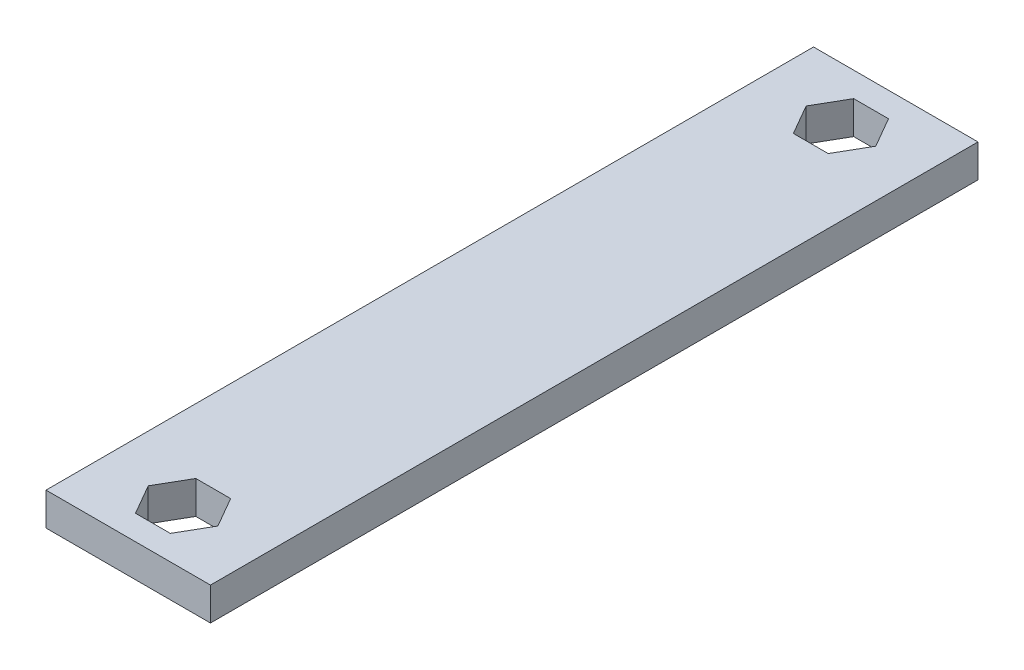
ISO-10303-21;
HEADER;
FILE_DESCRIPTION(('STEP AP214'),'2;1');
FILE_NAME('part.step','',(''),(''),'','','');
FILE_SCHEMA(('AUTOMOTIVE_DESIGN { 1 0 10303 214 1 1 1 1 }'));
ENDSEC;
DATA;
#1=APPLICATION_CONTEXT('core data for automotive mechanical design processes');
#2=APPLICATION_PROTOCOL_DEFINITION('international standard','automotive_design',2000,#1);
#3=PRODUCT_CONTEXT('',#1,'mechanical');
#4=PRODUCT('Part','Part','',(#3));
#5=PRODUCT_RELATED_PRODUCT_CATEGORY('part','',(#4));
#6=PRODUCT_DEFINITION_FORMATION('','',#4);
#7=PRODUCT_DEFINITION_CONTEXT('part definition',#1,'design');
#8=PRODUCT_DEFINITION('design','',#6,#7);
#9=PRODUCT_DEFINITION_SHAPE('','',#8);
#10=(LENGTH_UNIT() NAMED_UNIT(*) SI_UNIT(.MILLI.,.METRE.));
#11=(NAMED_UNIT(*) PLANE_ANGLE_UNIT() SI_UNIT($,.RADIAN.));
#12=(NAMED_UNIT(*) SI_UNIT($,.STERADIAN.) SOLID_ANGLE_UNIT());
#13=UNCERTAINTY_MEASURE_WITH_UNIT(LENGTH_MEASURE(1.E-05),#10,'distance_accuracy_value','');
#14=(GEOMETRIC_REPRESENTATION_CONTEXT(3) GLOBAL_UNCERTAINTY_ASSIGNED_CONTEXT((#13)) GLOBAL_UNIT_ASSIGNED_CONTEXT((#10,
#11,#12)) REPRESENTATION_CONTEXT('',''));
#15=CARTESIAN_POINT('',(0.,0.,0.));
#16=DIRECTION('',(0.,0.,1.));
#17=DIRECTION('',(1.,0.,0.));
#18=AXIS2_PLACEMENT_3D('',#15,#16,#17);
#19=CARTESIAN_POINT('',(0.,3.,-62.25));
#20=DIRECTION('',(0.,0.,1.));
#21=DIRECTION('',(1.,0.,0.));
#22=AXIS2_PLACEMENT_3D('',#19,#20,#21);
#23=PLANE('',#22);
#24=DIRECTION('',(-1.,0.,0.));
#25=VECTOR('',#24,1.);
#26=CARTESIAN_POINT('',(0.,0.,-62.25));
#27=LINE('',#26,#25);
#28=CARTESIAN_POINT('',(9.08771324027147,0.,-62.25));
#29=VERTEX_POINT('',#28);
#30=CARTESIAN_POINT('',(5.91228675972853,0.,-62.25));
#31=VERTEX_POINT('',#30);
#32=EDGE_CURVE('E234',#29,#31,#27,.T.);
#33=ORIENTED_EDGE('',*,*,#32,.T.);
#34=DIRECTION('',(0.,-1.,0.));
#35=VECTOR('',#34,1.);
#36=CARTESIAN_POINT('',(5.91228675972853,3.,-62.25));
#37=LINE('',#36,#35);
#38=CARTESIAN_POINT('',(5.91228675972853,3.,-62.25));
#39=VERTEX_POINT('',#38);
#40=EDGE_CURVE('E11',#39,#31,#37,.T.);
#41=ORIENTED_EDGE('',*,*,#40,.F.);
#42=DIRECTION('',(-1.,0.,0.));
#43=VECTOR('',#42,1.);
#44=CARTESIAN_POINT('',(0.,3.,-62.25));
#45=LINE('',#44,#43);
#46=CARTESIAN_POINT('',(9.08771324027147,3.,-62.25));
#47=VERTEX_POINT('',#46);
#48=EDGE_CURVE('E341',#47,#39,#45,.T.);
#49=ORIENTED_EDGE('',*,*,#48,.F.);
#50=DIRECTION('',(0.,-1.,0.));
#51=VECTOR('',#50,1.);
#52=CARTESIAN_POINT('',(9.08771324027147,3.,-62.25));
#53=LINE('',#52,#51);
#54=EDGE_CURVE('E251',#47,#29,#53,.T.);
#55=ORIENTED_EDGE('',*,*,#54,.T.);
#56=EDGE_LOOP('',(#33,#41,#49,#55));
#57=FACE_BOUND('',#56,.T.);
#58=ADVANCED_FACE('F41',(#57),#23,.F.);
#59=CARTESIAN_POINT('',(31.3892557625871,3.,-18.1225952641916));
#60=DIRECTION('',(-0.866025403784439,0.,0.5));
#61=DIRECTION('',(0.5,0.,0.866025403784439));
#62=AXIS2_PLACEMENT_3D('',#59,#60,#61);
#63=PLANE('',#62);
#64=DIRECTION('',(-0.5,0.,-0.866025403784439));
#65=VECTOR('',#64,1.);
#66=CARTESIAN_POINT('',(31.3892557625871,0.,-18.1225952641916));
#67=LINE('',#66,#65);
#68=CARTESIAN_POINT('',(4.32457351945706,0.,-65.));
#69=VERTEX_POINT('',#68);
#70=EDGE_CURVE('E238',#31,#69,#67,.T.);
#71=ORIENTED_EDGE('',*,*,#70,.T.);
#72=DIRECTION('',(0.,-1.,0.));
#73=VECTOR('',#72,1.);
#74=CARTESIAN_POINT('',(4.32457351945706,3.,-65.));
#75=LINE('',#74,#73);
#76=CARTESIAN_POINT('',(4.32457351945706,3.,-65.));
#77=VERTEX_POINT('',#76);
#78=EDGE_CURVE('E52',#77,#69,#75,.T.);
#79=ORIENTED_EDGE('',*,*,#78,.F.);
#80=DIRECTION('',(-0.5,0.,-0.866025403784439));
#81=VECTOR('',#80,1.);
#82=CARTESIAN_POINT('',(31.3892557625871,3.,-18.1225952641916));
#83=LINE('',#82,#81);
#84=EDGE_CURVE('E344',#39,#77,#83,.T.);
#85=ORIENTED_EDGE('',*,*,#84,.F.);
#86=ORIENTED_EDGE('',*,*,#40,.T.);
#87=EDGE_LOOP('',(#71,#79,#85,#86));
#88=FACE_BOUND('',#87,.T.);
#89=ADVANCED_FACE('F351',(#88),#63,.F.);
#90=CARTESIAN_POINT('',(-24.9023954834015,3.,-14.3774047358085));
#91=DIRECTION('',(-0.866025403784438,0.,-0.500000000000002));
#92=DIRECTION('',(-0.500000000000002,0.,0.866025403784438));
#93=AXIS2_PLACEMENT_3D('',#90,#91,#92);
#94=PLANE('',#93);
#95=DIRECTION('',(0.500000000000002,0.,-0.866025403784438));
#96=VECTOR('',#95,1.);
#97=CARTESIAN_POINT('',(-24.9023954834015,0.,-14.3774047358085));
#98=LINE('',#97,#96);
#99=CARTESIAN_POINT('',(5.91228675972853,0.,-67.75));
#100=VERTEX_POINT('',#99);
#101=EDGE_CURVE('E241',#69,#100,#98,.T.);
#102=ORIENTED_EDGE('',*,*,#101,.T.);
#103=DIRECTION('',(0.,-1.,0.));
#104=VECTOR('',#103,1.);
#105=CARTESIAN_POINT('',(5.91228675972853,3.,-67.75));
#106=LINE('',#105,#104);
#107=CARTESIAN_POINT('',(5.91228675972853,3.,-67.75));
#108=VERTEX_POINT('',#107);
#109=EDGE_CURVE('E183',#108,#100,#106,.T.);
#110=ORIENTED_EDGE('',*,*,#109,.F.);
#111=DIRECTION('',(0.500000000000002,0.,-0.866025403784438));
#112=VECTOR('',#111,1.);
#113=CARTESIAN_POINT('',(-24.9023954834015,3.,-14.3774047358085));
#114=LINE('',#113,#112);
#115=EDGE_CURVE('E172',#77,#108,#114,.T.);
#116=ORIENTED_EDGE('',*,*,#115,.F.);
#117=ORIENTED_EDGE('',*,*,#78,.T.);
#118=EDGE_LOOP('',(#102,#110,#116,#117));
#119=FACE_BOUND('',#118,.T.);
#120=ADVANCED_FACE('F354',(#119),#94,.F.);
#121=CARTESIAN_POINT('',(0.,3.,-67.75));
#122=DIRECTION('',(0.,0.,-1.));
#123=DIRECTION('',(-1.,0.,0.));
#124=AXIS2_PLACEMENT_3D('',#121,#122,#123);
#125=PLANE('',#124);
#126=DIRECTION('',(1.,0.,0.));
#127=VECTOR('',#126,1.);
#128=CARTESIAN_POINT('',(0.,0.,-67.75));
#129=LINE('',#128,#127);
#130=CARTESIAN_POINT('',(9.08771324027147,0.,-67.75));
#131=VERTEX_POINT('',#130);
#132=EDGE_CURVE('E181',#100,#131,#129,.T.);
#133=ORIENTED_EDGE('',*,*,#132,.T.);
#134=DIRECTION('',(0.,-1.,0.));
#135=VECTOR('',#134,1.);
#136=CARTESIAN_POINT('',(9.08771324027147,3.,-67.75));
#137=LINE('',#136,#135);
#138=CARTESIAN_POINT('',(9.08771324027147,3.,-67.75));
#139=VERTEX_POINT('',#138);
#140=EDGE_CURVE('E178',#139,#131,#137,.T.);
#141=ORIENTED_EDGE('',*,*,#140,.F.);
#142=DIRECTION('',(1.,0.,0.));
#143=VECTOR('',#142,1.);
#144=CARTESIAN_POINT('',(0.,3.,-67.75));
#145=LINE('',#144,#143);
#146=EDGE_CURVE('E166',#108,#139,#145,.T.);
#147=ORIENTED_EDGE('',*,*,#146,.F.);
#148=ORIENTED_EDGE('',*,*,#109,.T.);
#149=EDGE_LOOP('',(#133,#141,#147,#148));
#150=FACE_BOUND('',#149,.T.);
#151=ADVANCED_FACE('F179',(#150),#125,.F.);
#152=CARTESIAN_POINT('',(36.1523954834015,3.,-20.8725952641917));
#153=DIRECTION('',(0.866025403784438,0.,-0.500000000000001));
#154=DIRECTION('',(-0.500000000000001,0.,-0.866025403784438));
#155=AXIS2_PLACEMENT_3D('',#152,#153,#154);
#156=PLANE('',#155);
#157=DIRECTION('',(0.500000000000001,0.,0.866025403784438));
#158=VECTOR('',#157,1.);
#159=CARTESIAN_POINT('',(36.1523954834015,0.,-20.8725952641917));
#160=LINE('',#159,#158);
#161=CARTESIAN_POINT('',(10.6754264805429,0.,-65.));
#162=VERTEX_POINT('',#161);
#163=EDGE_CURVE('E114',#131,#162,#160,.T.);
#164=ORIENTED_EDGE('',*,*,#163,.T.);
#165=DIRECTION('',(0.,-1.,0.));
#166=VECTOR('',#165,1.);
#167=CARTESIAN_POINT('',(10.6754264805429,3.,-65.));
#168=LINE('',#167,#166);
#169=CARTESIAN_POINT('',(10.6754264805429,3.,-65.));
#170=VERTEX_POINT('',#169);
#171=EDGE_CURVE('E184',#170,#162,#168,.T.);
#172=ORIENTED_EDGE('',*,*,#171,.F.);
#173=DIRECTION('',(0.500000000000001,0.,0.866025403784438));
#174=VECTOR('',#173,1.);
#175=CARTESIAN_POINT('',(36.1523954834015,3.,-20.8725952641917));
#176=LINE('',#175,#174);
#177=EDGE_CURVE('E170',#139,#170,#176,.T.);
#178=ORIENTED_EDGE('',*,*,#177,.F.);
#179=ORIENTED_EDGE('',*,*,#140,.T.);
#180=EDGE_LOOP('',(#164,#172,#178,#179));
#181=FACE_BOUND('',#180,.T.);
#182=ADVANCED_FACE('F186',(#181),#156,.F.);
#183=CARTESIAN_POINT('',(0.,3.,0.));
#184=DIRECTION('',(0.,0.,-1.));
#185=DIRECTION('',(-1.,0.,0.));
#186=AXIS2_PLACEMENT_3D('',#183,#184,#185);
#187=PLANE('',#186);
#188=DIRECTION('',(1.,0.,0.));
#189=VECTOR('',#188,1.);
#190=CARTESIAN_POINT('',(0.,0.,0.));
#191=LINE('',#190,#189);
#192=CARTESIAN_POINT('',(0.,0.,0.));
#193=VERTEX_POINT('',#192);
#194=CARTESIAN_POINT('',(15.,0.,0.));
#195=VERTEX_POINT('',#194);
#196=EDGE_CURVE('E218',#193,#195,#191,.T.);
#197=ORIENTED_EDGE('',*,*,#196,.T.);
#198=DIRECTION('',(0.,-1.,0.));
#199=VECTOR('',#198,1.);
#200=CARTESIAN_POINT('',(15.,3.,0.));
#201=LINE('',#200,#199);
#202=CARTESIAN_POINT('',(15.,3.,0.));
#203=VERTEX_POINT('',#202);
#204=EDGE_CURVE('E254',#203,#195,#201,.T.);
#205=ORIENTED_EDGE('',*,*,#204,.F.);
#206=DIRECTION('',(1.,0.,0.));
#207=VECTOR('',#206,1.);
#208=CARTESIAN_POINT('',(0.,3.,0.));
#209=LINE('',#208,#207);
#210=CARTESIAN_POINT('',(0.,3.,0.));
#211=VERTEX_POINT('',#210);
#212=EDGE_CURVE('E326',#211,#203,#209,.T.);
#213=ORIENTED_EDGE('',*,*,#212,.F.);
#214=DIRECTION('',(0.,-1.,0.));
#215=VECTOR('',#214,1.);
#216=CARTESIAN_POINT('',(0.,3.,0.));
#217=LINE('',#216,#215);
#218=EDGE_CURVE('E262',#211,#193,#217,.T.);
#219=ORIENTED_EDGE('',*,*,#218,.T.);
#220=EDGE_LOOP('',(#197,#205,#213,#219));
#221=FACE_BOUND('',#220,.T.);
#222=ADVANCED_FACE('F391',(#221),#187,.F.);
#223=CARTESIAN_POINT('',(15.,3.,0.));
#224=DIRECTION('',(-1.,0.,0.));
#225=DIRECTION('',(0.,0.,1.));
#226=AXIS2_PLACEMENT_3D('',#223,#224,#225);
#227=PLANE('',#226);
#228=DIRECTION('',(0.,0.,-1.));
#229=VECTOR('',#228,1.);
#230=CARTESIAN_POINT('',(15.,0.,0.));
#231=LINE('',#230,#229);
#232=CARTESIAN_POINT('',(15.,0.,-70.));
#233=VERTEX_POINT('',#232);
#234=EDGE_CURVE('E222',#195,#233,#231,.T.);
#235=ORIENTED_EDGE('',*,*,#234,.T.);
#236=DIRECTION('',(0.,-1.,0.));
#237=VECTOR('',#236,1.);
#238=CARTESIAN_POINT('',(15.,3.,-70.));
#239=LINE('',#238,#237);
#240=CARTESIAN_POINT('',(15.,3.,-70.));
#241=VERTEX_POINT('',#240);
#242=EDGE_CURVE('E268',#241,#233,#239,.T.);
#243=ORIENTED_EDGE('',*,*,#242,.F.);
#244=DIRECTION('',(0.,0.,-1.));
#245=VECTOR('',#244,1.);
#246=CARTESIAN_POINT('',(15.,3.,0.));
#247=LINE('',#246,#245);
#248=EDGE_CURVE('E330',#203,#241,#247,.T.);
#249=ORIENTED_EDGE('',*,*,#248,.F.);
#250=ORIENTED_EDGE('',*,*,#204,.T.);
#251=EDGE_LOOP('',(#235,#243,#249,#250));
#252=FACE_BOUND('',#251,.T.);
#253=ADVANCED_FACE('F387',(#252),#227,.F.);
#254=CARTESIAN_POINT('',(0.,3.,-70.));
#255=DIRECTION('',(0.,0.,-1.));
#256=DIRECTION('',(-1.,0.,0.));
#257=AXIS2_PLACEMENT_3D('',#254,#255,#256);
#258=PLANE('',#257);
#259=DIRECTION('',(1.,0.,0.));
#260=VECTOR('',#259,1.);
#261=CARTESIAN_POINT('',(0.,0.,-70.));
#262=LINE('',#261,#260);
#263=CARTESIAN_POINT('',(0.,0.,-70.));
#264=VERTEX_POINT('',#263);
#265=EDGE_CURVE('E226',#264,#233,#262,.T.);
#266=ORIENTED_EDGE('',*,*,#265,.F.);
#267=DIRECTION('',(0.,-1.,0.));
#268=VECTOR('',#267,1.);
#269=CARTESIAN_POINT('',(0.,3.,-70.));
#270=LINE('',#269,#268);
#271=CARTESIAN_POINT('',(0.,3.,-70.));
#272=VERTEX_POINT('',#271);
#273=EDGE_CURVE('E265',#272,#264,#270,.T.);
#274=ORIENTED_EDGE('',*,*,#273,.F.);
#275=DIRECTION('',(1.,0.,0.));
#276=VECTOR('',#275,1.);
#277=CARTESIAN_POINT('',(0.,3.,-70.));
#278=LINE('',#277,#276);
#279=EDGE_CURVE('E333',#272,#241,#278,.T.);
#280=ORIENTED_EDGE('',*,*,#279,.T.);
#281=ORIENTED_EDGE('',*,*,#242,.T.);
#282=EDGE_LOOP('',(#266,#274,#280,#281));
#283=FACE_BOUND('',#282,.T.);
#284=ADVANCED_FACE('F384',(#283),#258,.T.);
#285=CARTESIAN_POINT('',(0.,3.,-7.75));
#286=DIRECTION('',(0.,0.,1.));
#287=DIRECTION('',(1.,0.,0.));
#288=AXIS2_PLACEMENT_3D('',#285,#286,#287);
#289=PLANE('',#288);
#290=DIRECTION('',(-1.,0.,0.));
#291=VECTOR('',#290,1.);
#292=CARTESIAN_POINT('',(0.,0.,-7.75));
#293=LINE('',#292,#291);
#294=CARTESIAN_POINT('',(9.08771324027147,0.,-7.75));
#295=VERTEX_POINT('',#294);
#296=CARTESIAN_POINT('',(5.91228675972853,0.,-7.75));
#297=VERTEX_POINT('',#296);
#298=EDGE_CURVE('E194',#295,#297,#293,.T.);
#299=ORIENTED_EDGE('',*,*,#298,.F.);
#300=DIRECTION('',(0.,-1.,0.));
#301=VECTOR('',#300,1.);
#302=CARTESIAN_POINT('',(9.08771324027147,3.,-7.75));
#303=LINE('',#302,#301);
#304=CARTESIAN_POINT('',(9.08771324027147,3.,-7.75));
#305=VERTEX_POINT('',#304);
#306=EDGE_CURVE('E45',#305,#295,#303,.T.);
#307=ORIENTED_EDGE('',*,*,#306,.F.);
#308=DIRECTION('',(-1.,0.,0.));
#309=VECTOR('',#308,1.);
#310=CARTESIAN_POINT('',(0.,3.,-7.75));
#311=LINE('',#310,#309);
#312=CARTESIAN_POINT('',(5.91228675972853,3.,-7.75));
#313=VERTEX_POINT('',#312);
#314=EDGE_CURVE('E250',#305,#313,#311,.T.);
#315=ORIENTED_EDGE('',*,*,#314,.T.);
#316=DIRECTION('',(0.,-1.,0.));
#317=VECTOR('',#316,1.);
#318=CARTESIAN_POINT('',(5.91228675972853,3.,-7.75));
#319=LINE('',#318,#317);
#320=EDGE_CURVE('E190',#313,#297,#319,.T.);
#321=ORIENTED_EDGE('',*,*,#320,.T.);
#322=EDGE_LOOP('',(#299,#307,#315,#321));
#323=FACE_BOUND('',#322,.T.);
#324=ADVANCED_FACE('F43',(#323),#289,.T.);
#325=CARTESIAN_POINT('',(10.1716333698683,3.,-5.87259526419165));
#326=DIRECTION('',(-0.866025403784438,0.,0.500000000000001));
#327=DIRECTION('',(0.500000000000001,0.,0.866025403784438));
#328=AXIS2_PLACEMENT_3D('',#325,#326,#327);
#329=PLANE('',#328);
#330=DIRECTION('',(-0.500000000000001,0.,-0.866025403784438));
#331=VECTOR('',#330,1.);
#332=CARTESIAN_POINT('',(10.1716333698683,0.,-5.87259526419165));
#333=LINE('',#332,#331);
#334=CARTESIAN_POINT('',(10.6754264805429,0.,-5.));
#335=VERTEX_POINT('',#334);
#336=EDGE_CURVE('E198',#335,#295,#333,.T.);
#337=ORIENTED_EDGE('',*,*,#336,.F.);
#338=DIRECTION('',(0.,-1.,0.));
#339=VECTOR('',#338,1.);
#340=CARTESIAN_POINT('',(10.6754264805429,3.,-5.));
#341=LINE('',#340,#339);
#342=CARTESIAN_POINT('',(10.6754264805429,3.,-5.));
#343=VERTEX_POINT('',#342);
#344=EDGE_CURVE('E284',#343,#335,#341,.T.);
#345=ORIENTED_EDGE('',*,*,#344,.F.);
#346=DIRECTION('',(-0.500000000000001,0.,-0.866025403784438));
#347=VECTOR('',#346,1.);
#348=CARTESIAN_POINT('',(10.1716333698683,3.,-5.87259526419165));
#349=LINE('',#348,#347);
#350=EDGE_CURVE('E295',#343,#305,#349,.T.);
#351=ORIENTED_EDGE('',*,*,#350,.T.);
#352=ORIENTED_EDGE('',*,*,#306,.T.);
#353=EDGE_LOOP('',(#337,#345,#351,#352));
#354=FACE_BOUND('',#353,.T.);
#355=ADVANCED_FACE('F293',(#354),#329,.T.);
#356=CARTESIAN_POINT('',(5.84150635094611,3.,3.37259526419164));
#357=DIRECTION('',(-0.866025403784438,0.,-0.5));
#358=DIRECTION('',(-0.5,0.,0.866025403784439));
#359=AXIS2_PLACEMENT_3D('',#356,#357,#358);
#360=PLANE('',#359);
#361=DIRECTION('',(0.5,0.,-0.866025403784439));
#362=VECTOR('',#361,1.);
#363=CARTESIAN_POINT('',(5.84150635094611,0.,3.37259526419164));
#364=LINE('',#363,#362);
#365=CARTESIAN_POINT('',(9.08771324027147,0.,-2.25000000000001));
#366=VERTEX_POINT('',#365);
#367=EDGE_CURVE('E202',#366,#335,#364,.T.);
#368=ORIENTED_EDGE('',*,*,#367,.F.);
#369=DIRECTION('',(0.,-1.,0.));
#370=VECTOR('',#369,1.);
#371=CARTESIAN_POINT('',(9.08771324027147,3.,-2.25000000000001));
#372=LINE('',#371,#370);
#373=CARTESIAN_POINT('',(9.08771324027147,3.,-2.25000000000001));
#374=VERTEX_POINT('',#373);
#375=EDGE_CURVE('E282',#374,#366,#372,.T.);
#376=ORIENTED_EDGE('',*,*,#375,.F.);
#377=DIRECTION('',(0.5,0.,-0.866025403784439));
#378=VECTOR('',#377,1.);
#379=CARTESIAN_POINT('',(5.84150635094611,3.,3.37259526419164));
#380=LINE('',#379,#378);
#381=EDGE_CURVE('E303',#374,#343,#380,.T.);
#382=ORIENTED_EDGE('',*,*,#381,.T.);
#383=ORIENTED_EDGE('',*,*,#344,.T.);
#384=EDGE_LOOP('',(#368,#376,#382,#383));
#385=FACE_BOUND('',#384,.T.);
#386=ADVANCED_FACE('F301',(#385),#360,.T.);
#387=CARTESIAN_POINT('',(0.,3.,-2.25000000000001));
#388=DIRECTION('',(0.,0.,-1.));
#389=DIRECTION('',(-1.,0.,0.));
#390=AXIS2_PLACEMENT_3D('',#387,#388,#389);
#391=PLANE('',#390);
#392=DIRECTION('',(1.,0.,0.));
#393=VECTOR('',#392,1.);
#394=CARTESIAN_POINT('',(0.,0.,-2.25000000000001));
#395=LINE('',#394,#393);
#396=CARTESIAN_POINT('',(5.91228675972853,0.,-2.25000000000001));
#397=VERTEX_POINT('',#396);
#398=EDGE_CURVE('E206',#397,#366,#395,.T.);
#399=ORIENTED_EDGE('',*,*,#398,.F.);
#400=DIRECTION('',(0.,-1.,0.));
#401=VECTOR('',#400,1.);
#402=CARTESIAN_POINT('',(5.91228675972853,3.,-2.25000000000001));
#403=LINE('',#402,#401);
#404=CARTESIAN_POINT('',(5.91228675972853,3.,-2.25000000000001));
#405=VERTEX_POINT('',#404);
#406=EDGE_CURVE('E279',#405,#397,#403,.T.);
#407=ORIENTED_EDGE('',*,*,#406,.F.);
#408=DIRECTION('',(1.,0.,0.));
#409=VECTOR('',#408,1.);
#410=CARTESIAN_POINT('',(0.,3.,-2.25000000000001));
#411=LINE('',#410,#409);
#412=EDGE_CURVE('E310',#405,#374,#411,.T.);
#413=ORIENTED_EDGE('',*,*,#412,.T.);
#414=ORIENTED_EDGE('',*,*,#375,.T.);
#415=EDGE_LOOP('',(#399,#407,#413,#414));
#416=FACE_BOUND('',#415,.T.);
#417=ADVANCED_FACE('F314',(#416),#391,.T.);
#418=CARTESIAN_POINT('',(5.40849364905389,3.,-3.12259526419165));
#419=DIRECTION('',(0.866025403784438,0.,-0.5));
#420=DIRECTION('',(-0.5,0.,-0.866025403784439));
#421=AXIS2_PLACEMENT_3D('',#418,#419,#420);
#422=PLANE('',#421);
#423=DIRECTION('',(0.5,0.,0.866025403784438));
#424=VECTOR('',#423,1.);
#425=CARTESIAN_POINT('',(5.40849364905389,0.,-3.12259526419165));
#426=LINE('',#425,#424);
#427=CARTESIAN_POINT('',(4.32457351945706,0.,-5.00000000000001));
#428=VERTEX_POINT('',#427);
#429=EDGE_CURVE('E210',#428,#397,#426,.T.);
#430=ORIENTED_EDGE('',*,*,#429,.F.);
#431=DIRECTION('',(0.,-1.,0.));
#432=VECTOR('',#431,1.);
#433=CARTESIAN_POINT('',(4.32457351945706,3.,-5.00000000000001));
#434=LINE('',#433,#432);
#435=CARTESIAN_POINT('',(4.32457351945706,3.,-5.00000000000001));
#436=VERTEX_POINT('',#435);
#437=EDGE_CURVE('E276',#436,#428,#434,.T.);
#438=ORIENTED_EDGE('',*,*,#437,.F.);
#439=DIRECTION('',(0.5,0.,0.866025403784438));
#440=VECTOR('',#439,1.);
#441=CARTESIAN_POINT('',(5.40849364905389,3.,-3.12259526419165));
#442=LINE('',#441,#440);
#443=EDGE_CURVE('E316',#436,#405,#442,.T.);
#444=ORIENTED_EDGE('',*,*,#443,.T.);
#445=ORIENTED_EDGE('',*,*,#406,.T.);
#446=EDGE_LOOP('',(#430,#438,#444,#445));
#447=FACE_BOUND('',#446,.T.);
#448=ADVANCED_FACE('F382',(#447),#422,.T.);
#449=CARTESIAN_POINT('',(0.,3.,0.));
#450=DIRECTION('',(-1.,0.,0.));
#451=DIRECTION('',(0.,0.,1.));
#452=AXIS2_PLACEMENT_3D('',#449,#450,#451);
#453=PLANE('',#452);
#454=DIRECTION('',(0.,0.,-1.));
#455=VECTOR('',#454,1.);
#456=CARTESIAN_POINT('',(0.,0.,0.));
#457=LINE('',#456,#455);
#458=EDGE_CURVE('E230',#193,#264,#457,.T.);
#459=ORIENTED_EDGE('',*,*,#458,.F.);
#460=ORIENTED_EDGE('',*,*,#218,.F.);
#461=DIRECTION('',(0.,0.,-1.));
#462=VECTOR('',#461,1.);
#463=CARTESIAN_POINT('',(0.,3.,0.));
#464=LINE('',#463,#462);
#465=EDGE_CURVE('E337',#211,#272,#464,.T.);
#466=ORIENTED_EDGE('',*,*,#465,.T.);
#467=ORIENTED_EDGE('',*,*,#273,.T.);
#468=EDGE_LOOP('',(#459,#460,#466,#467));
#469=FACE_BOUND('',#468,.T.);
#470=ADVANCED_FACE('F367',(#469),#453,.T.);
#471=CARTESIAN_POINT('',(1.07836663013169,3.,0.622595264191642));
#472=DIRECTION('',(0.866025403784438,0.,0.500000000000001));
#473=DIRECTION('',(0.500000000000001,0.,-0.866025403784438));
#474=AXIS2_PLACEMENT_3D('',#471,#472,#473);
#475=PLANE('',#474);
#476=DIRECTION('',(-0.500000000000001,0.,0.866025403784438));
#477=VECTOR('',#476,1.);
#478=CARTESIAN_POINT('',(1.07836663013169,0.,0.622595264191642));
#479=LINE('',#478,#477);
#480=EDGE_CURVE('E214',#297,#428,#479,.T.);
#481=ORIENTED_EDGE('',*,*,#480,.F.);
#482=ORIENTED_EDGE('',*,*,#320,.F.);
#483=DIRECTION('',(-0.500000000000001,0.,0.866025403784438));
#484=VECTOR('',#483,1.);
#485=CARTESIAN_POINT('',(1.07836663013169,3.,0.622595264191642));
#486=LINE('',#485,#484);
#487=EDGE_CURVE('E319',#313,#436,#486,.T.);
#488=ORIENTED_EDGE('',*,*,#487,.T.);
#489=ORIENTED_EDGE('',*,*,#437,.T.);
#490=EDGE_LOOP('',(#481,#482,#488,#489));
#491=FACE_BOUND('',#490,.T.);
#492=ADVANCED_FACE('F360',(#491),#475,.T.);
#493=CARTESIAN_POINT('',(-20.1392557625871,3.,-11.6274047358084));
#494=DIRECTION('',(0.866025403784438,0.,0.5));
#495=DIRECTION('',(0.5,0.,-0.866025403784439));
#496=AXIS2_PLACEMENT_3D('',#493,#494,#495);
#497=PLANE('',#496);
#498=DIRECTION('',(-0.5,0.,0.866025403784438));
#499=VECTOR('',#498,1.);
#500=CARTESIAN_POINT('',(-20.1392557625871,0.,-11.6274047358084));
#501=LINE('',#500,#499);
#502=EDGE_CURVE('E120',#162,#29,#501,.T.);
#503=ORIENTED_EDGE('',*,*,#502,.T.);
#504=ORIENTED_EDGE('',*,*,#54,.F.);
#505=DIRECTION('',(-0.5,0.,0.866025403784438));
#506=VECTOR('',#505,1.);
#507=CARTESIAN_POINT('',(-20.1392557625871,3.,-11.6274047358084));
#508=LINE('',#507,#506);
#509=EDGE_CURVE('E61',#170,#47,#508,.T.);
#510=ORIENTED_EDGE('',*,*,#509,.F.);
#511=ORIENTED_EDGE('',*,*,#171,.T.);
#512=EDGE_LOOP('',(#503,#504,#510,#511));
#513=FACE_BOUND('',#512,.T.);
#514=ADVANCED_FACE('F358',(#513),#497,.F.);
#515=CARTESIAN_POINT('',(0.,3.,0.));
#516=DIRECTION('',(0.,1.,0.));
#517=DIRECTION('',(0.,0.,1.));
#518=AXIS2_PLACEMENT_3D('',#515,#516,#517);
#519=PLANE('',#518);
#520=ORIENTED_EDGE('',*,*,#314,.F.);
#521=ORIENTED_EDGE('',*,*,#350,.F.);
#522=ORIENTED_EDGE('',*,*,#381,.F.);
#523=ORIENTED_EDGE('',*,*,#412,.F.);
#524=ORIENTED_EDGE('',*,*,#443,.F.);
#525=ORIENTED_EDGE('',*,*,#487,.F.);
#526=EDGE_LOOP('',(#520,#521,#522,#523,#524,#525));
#527=FACE_BOUND('',#526,.T.);
#528=ORIENTED_EDGE('',*,*,#212,.T.);
#529=ORIENTED_EDGE('',*,*,#248,.T.);
#530=ORIENTED_EDGE('',*,*,#279,.F.);
#531=ORIENTED_EDGE('',*,*,#465,.F.);
#532=EDGE_LOOP('',(#528,#529,#530,#531));
#533=FACE_BOUND('',#532,.T.);
#534=ORIENTED_EDGE('',*,*,#48,.T.);
#535=ORIENTED_EDGE('',*,*,#84,.T.);
#536=ORIENTED_EDGE('',*,*,#115,.T.);
#537=ORIENTED_EDGE('',*,*,#146,.T.);
#538=ORIENTED_EDGE('',*,*,#177,.T.);
#539=ORIENTED_EDGE('',*,*,#509,.T.);
#540=EDGE_LOOP('',(#534,#535,#536,#537,#538,#539));
#541=FACE_BOUND('',#540,.T.);
#542=ADVANCED_FACE('F168',(#527,#533,#541),#519,.T.);
#543=CARTESIAN_POINT('',(0.,0.,0.));
#544=DIRECTION('',(0.,1.,0.));
#545=DIRECTION('',(0.,0.,1.));
#546=AXIS2_PLACEMENT_3D('',#543,#544,#545);
#547=PLANE('',#546);
#548=ORIENTED_EDGE('',*,*,#298,.T.);
#549=ORIENTED_EDGE('',*,*,#480,.T.);
#550=ORIENTED_EDGE('',*,*,#429,.T.);
#551=ORIENTED_EDGE('',*,*,#398,.T.);
#552=ORIENTED_EDGE('',*,*,#367,.T.);
#553=ORIENTED_EDGE('',*,*,#336,.T.);
#554=EDGE_LOOP('',(#548,#549,#550,#551,#552,#553));
#555=FACE_BOUND('',#554,.T.);
#556=ORIENTED_EDGE('',*,*,#196,.F.);
#557=ORIENTED_EDGE('',*,*,#458,.T.);
#558=ORIENTED_EDGE('',*,*,#265,.T.);
#559=ORIENTED_EDGE('',*,*,#234,.F.);
#560=EDGE_LOOP('',(#556,#557,#558,#559));
#561=FACE_BOUND('',#560,.T.);
#562=ORIENTED_EDGE('',*,*,#32,.F.);
#563=ORIENTED_EDGE('',*,*,#502,.F.);
#564=ORIENTED_EDGE('',*,*,#163,.F.);
#565=ORIENTED_EDGE('',*,*,#132,.F.);
#566=ORIENTED_EDGE('',*,*,#101,.F.);
#567=ORIENTED_EDGE('',*,*,#70,.F.);
#568=EDGE_LOOP('',(#562,#563,#564,#565,#566,#567));
#569=FACE_BOUND('',#568,.T.);
#570=ADVANCED_FACE('F298',(#555,#561,#569),#547,.F.);
#571=CLOSED_SHELL('',(#58,#89,#120,#151,#182,#222,#253,#284,#324,#355,#386,#417,#448,#470,#492,
#514,#542,#570));
#572=MANIFOLD_SOLID_BREP('B2',#571);
#573=ADVANCED_BREP_SHAPE_REPRESENTATION('',(#18,#572),#14);
#574=SHAPE_DEFINITION_REPRESENTATION(#9,#573);
ENDSEC;
END-ISO-10303-21;
